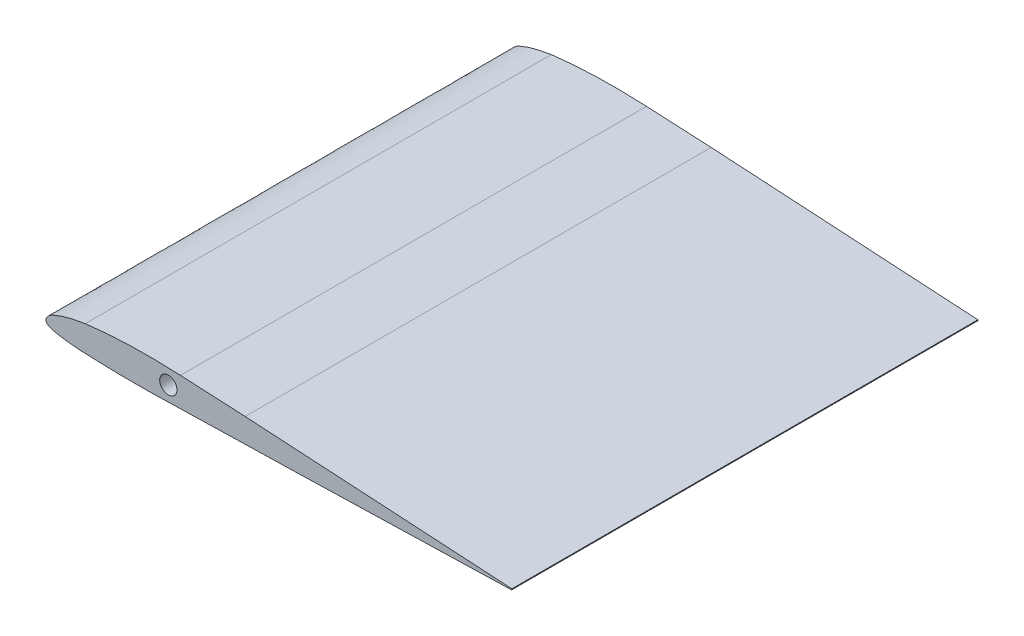
ISO-10303-21;
HEADER;
FILE_DESCRIPTION(('STEP AP214'),'2;1');
FILE_NAME('part.step','',(''),(''),'','','');
FILE_SCHEMA(('AUTOMOTIVE_DESIGN { 1 0 10303 214 1 1 1 1 }'));
ENDSEC;
DATA;
#1=APPLICATION_CONTEXT('core data for automotive mechanical design processes');
#2=APPLICATION_PROTOCOL_DEFINITION('international standard','automotive_design',2000,#1);
#3=PRODUCT_CONTEXT('',#1,'mechanical');
#4=PRODUCT('Part','Part','',(#3));
#5=PRODUCT_RELATED_PRODUCT_CATEGORY('part','',(#4));
#6=PRODUCT_DEFINITION_FORMATION('','',#4);
#7=PRODUCT_DEFINITION_CONTEXT('part definition',#1,'design');
#8=PRODUCT_DEFINITION('design','',#6,#7);
#9=PRODUCT_DEFINITION_SHAPE('','',#8);
#10=(LENGTH_UNIT() NAMED_UNIT(*) SI_UNIT(.MILLI.,.METRE.));
#11=(NAMED_UNIT(*) PLANE_ANGLE_UNIT() SI_UNIT($,.RADIAN.));
#12=(NAMED_UNIT(*) SI_UNIT($,.STERADIAN.) SOLID_ANGLE_UNIT());
#13=UNCERTAINTY_MEASURE_WITH_UNIT(LENGTH_MEASURE(1.E-05),#10,'distance_accuracy_value','');
#14=(GEOMETRIC_REPRESENTATION_CONTEXT(3) GLOBAL_UNCERTAINTY_ASSIGNED_CONTEXT((#13)) GLOBAL_UNIT_ASSIGNED_CONTEXT((#10,
#11,#12)) REPRESENTATION_CONTEXT('',''));
#15=CARTESIAN_POINT('',(0.,0.,0.));
#16=DIRECTION('',(0.,0.,1.));
#17=DIRECTION('',(1.,0.,0.));
#18=AXIS2_PLACEMENT_3D('',#15,#16,#17);
#19=CARTESIAN_POINT('',(202.827832333047,8.99151171703338,203.2));
#20=DIRECTION('',(0.,0.,-1.));
#21=DIRECTION('',(-1.,0.,0.));
#22=AXIS2_PLACEMENT_3D('',#19,#20,#21);
#23=CYLINDRICAL_SURFACE('',#22,0.372086183591873);
#24=CARTESIAN_POINT('',(202.827832333047,8.99151171703338,0.));
#25=DIRECTION('',(0.,0.,1.));
#26=DIRECTION('',(-1.,0.,0.));
#27=AXIS2_PLACEMENT_3D('',#24,#25,#26);
#28=CIRCLE('',#27,0.372086183591873);
#29=CARTESIAN_POINT('',(202.994130811724,8.65865597649471,0.));
#30=VERTEX_POINT('',#29);
#31=CARTESIAN_POINT('',(203.160688073585,9.15781019571088,0.));
#32=VERTEX_POINT('',#31);
#33=EDGE_CURVE('E127',#30,#32,#28,.T.);
#34=ORIENTED_EDGE('',*,*,#33,.T.);
#35=DIRECTION('',(0.,0.,-1.));
#36=VECTOR('',#35,1.);
#37=CARTESIAN_POINT('',(203.160688073585,9.15781019571088,203.2));
#38=LINE('',#37,#36);
#39=CARTESIAN_POINT('',(203.160688073585,9.15781019571088,203.2));
#40=VERTEX_POINT('',#39);
#41=EDGE_CURVE('E11',#40,#32,#38,.T.);
#42=ORIENTED_EDGE('',*,*,#41,.F.);
#43=CARTESIAN_POINT('',(202.827832333047,8.99151171703338,203.2));
#44=DIRECTION('',(0.,0.,1.));
#45=DIRECTION('',(-1.,0.,0.));
#46=AXIS2_PLACEMENT_3D('',#43,#44,#45);
#47=CIRCLE('',#46,0.372086183591873);
#48=CARTESIAN_POINT('',(202.994130811724,8.65865597649471,203.2));
#49=VERTEX_POINT('',#48);
#50=EDGE_CURVE('E150',#49,#40,#47,.T.);
#51=ORIENTED_EDGE('',*,*,#50,.F.);
#52=DIRECTION('',(0.,0.,-1.));
#53=VECTOR('',#52,1.);
#54=CARTESIAN_POINT('',(202.994130811724,8.65865597649471,203.2));
#55=LINE('',#54,#53);
#56=EDGE_CURVE('E120',#49,#30,#55,.T.);
#57=ORIENTED_EDGE('',*,*,#56,.T.);
#58=EDGE_LOOP('',(#34,#42,#51,#57));
#59=FACE_BOUND('',#58,.T.);
#60=ADVANCED_FACE('F34',(#59),#23,.T.);
#61=CARTESIAN_POINT('',(86.8464684635656,16.0766133823899,203.2));
#62=DIRECTION('',(-0.0593787685571856,-0.998235524234953,0.));
#63=DIRECTION('',(0.998235524234953,-0.0593787685571856,0.));
#64=AXIS2_PLACEMENT_3D('',#61,#62,#63);
#65=PLANE('',#64);
#66=DIRECTION('',(-0.998235524234953,0.0593787685571856,0.));
#67=VECTOR('',#66,1.);
#68=CARTESIAN_POINT('',(86.8464684635656,16.0766133823899,0.));
#69=LINE('',#68,#67);
#70=CARTESIAN_POINT('',(86.8464684635656,16.0766133823899,0.));
#71=VERTEX_POINT('',#70);
#72=EDGE_CURVE('E130',#32,#71,#69,.T.);
#73=ORIENTED_EDGE('',*,*,#72,.T.);
#74=DIRECTION('',(0.,0.,-1.));
#75=VECTOR('',#74,1.);
#76=CARTESIAN_POINT('',(86.8464684635656,16.0766133823899,203.2));
#77=LINE('',#76,#75);
#78=CARTESIAN_POINT('',(86.8464684635656,16.0766133823899,203.2));
#79=VERTEX_POINT('',#78);
#80=EDGE_CURVE('E42',#79,#71,#77,.T.);
#81=ORIENTED_EDGE('',*,*,#80,.F.);
#82=DIRECTION('',(-0.998235524234953,0.0593787685571858,0.));
#83=VECTOR('',#82,1.);
#84=CARTESIAN_POINT('',(160.978559463566,11.6669603823899,203.2));
#85=LINE('',#84,#83);
#86=EDGE_CURVE('E90',#40,#79,#85,.T.);
#87=ORIENTED_EDGE('',*,*,#86,.F.);
#88=ORIENTED_EDGE('',*,*,#41,.T.);
#89=EDGE_LOOP('',(#73,#81,#87,#88));
#90=FACE_BOUND('',#89,.T.);
#91=ADVANCED_FACE('F183',(#90),#65,.F.);
#92=CARTESIAN_POINT('',(58.6413294635656,17.4910303823899,203.2));
#93=DIRECTION('',(-0.0500845565723408,-0.998744981060206,0.));
#94=DIRECTION('',(0.998744981060206,-0.0500845565723408,0.));
#95=AXIS2_PLACEMENT_3D('',#92,#93,#94);
#96=PLANE('',#95);
#97=DIRECTION('',(-0.998744981060206,0.0500845565723408,0.));
#98=VECTOR('',#97,1.);
#99=CARTESIAN_POINT('',(58.6413294635656,17.4910303823899,0.));
#100=LINE('',#99,#98);
#101=CARTESIAN_POINT('',(58.6413294635656,17.4910303823899,0.));
#102=VERTEX_POINT('',#101);
#103=EDGE_CURVE('E133',#71,#102,#100,.T.);
#104=ORIENTED_EDGE('',*,*,#103,.T.);
#105=DIRECTION('',(0.,0.,-1.));
#106=VECTOR('',#105,1.);
#107=CARTESIAN_POINT('',(58.6413294635656,17.4910303823899,203.2));
#108=LINE('',#107,#106);
#109=CARTESIAN_POINT('',(58.6413294635656,17.4910303823899,203.2));
#110=VERTEX_POINT('',#109);
#111=EDGE_CURVE('E154',#110,#102,#108,.T.);
#112=ORIENTED_EDGE('',*,*,#111,.F.);
#113=DIRECTION('',(-0.998744981060206,0.0500845565723408,0.));
#114=VECTOR('',#113,1.);
#115=CARTESIAN_POINT('',(58.6413294635656,17.4910303823899,203.2));
#116=LINE('',#115,#114);
#117=EDGE_CURVE('E162',#79,#110,#116,.T.);
#118=ORIENTED_EDGE('',*,*,#117,.F.);
#119=ORIENTED_EDGE('',*,*,#80,.T.);
#120=EDGE_LOOP('',(#104,#112,#118,#119));
#121=FACE_BOUND('',#120,.T.);
#122=ADVANCED_FACE('F160',(#121),#96,.F.);
#123=CARTESIAN_POINT('',(58.6413294635656,17.4910303823899,203.2));
#124=CARTESIAN_POINT('',(42.670326444902,18.2919361384881,203.2));
#125=CARTESIAN_POINT('',(28.8324992549502,17.7256532786536,203.2));
#126=CARTESIAN_POINT('',(17.1496206863918,16.2749573556541,203.2));
#127=B_SPLINE_CURVE_WITH_KNOTS('',3,(#123,#124,#125,#126),.UNSPECIFIED.,.F.,.F.,(4,4),(0.,1.),.UNSPECIFIED.);
#128=DIRECTION('',(0.,0.,-1.));
#129=VECTOR('',#128,1.);
#130=SURFACE_OF_LINEAR_EXTRUSION('',#127,#129);
#131=CARTESIAN_POINT('',(58.6413294635656,17.4910303823899,0.));
#132=CARTESIAN_POINT('',(42.670326444902,18.2919361384881,0.));
#133=CARTESIAN_POINT('',(28.8324992549502,17.7256532786536,0.));
#134=CARTESIAN_POINT('',(17.1496206863918,16.2749573556541,0.));
#135=B_SPLINE_CURVE_WITH_KNOTS('',3,(#131,#132,#133,#134),.UNSPECIFIED.,.F.,.F.,(4,4),(0.,1.),.UNSPECIFIED.);
#136=CARTESIAN_POINT('',(17.1496206863918,16.2749573556541,0.));
#137=VERTEX_POINT('',#136);
#138=EDGE_CURVE('E135',#102,#137,#135,.T.);
#139=ORIENTED_EDGE('',*,*,#138,.T.);
#140=DIRECTION('',(0.,0.,-1.));
#141=VECTOR('',#140,1.);
#142=CARTESIAN_POINT('',(17.1496206863918,16.2749573556541,203.2));
#143=LINE('',#142,#141);
#144=CARTESIAN_POINT('',(17.1496206863918,16.2749573556541,203.2));
#145=VERTEX_POINT('',#144);
#146=EDGE_CURVE('E115',#145,#137,#143,.T.);
#147=ORIENTED_EDGE('',*,*,#146,.F.);
#148=EDGE_CURVE('E106',#110,#145,#127,.T.);
#149=ORIENTED_EDGE('',*,*,#148,.F.);
#150=ORIENTED_EDGE('',*,*,#111,.T.);
#151=EDGE_LOOP('',(#139,#147,#149,#150));
#152=FACE_BOUND('',#151,.T.);
#153=ADVANCED_FACE('F168',(#152),#130,.F.);
#154=CARTESIAN_POINT('',(17.1496206863918,16.2749573556541,203.2));
#155=CARTESIAN_POINT('',(14.6911508328745,15.883501489424,203.2));
#156=CARTESIAN_POINT('',(12.2625608927409,15.4044355735924,203.2));
#157=CARTESIAN_POINT('',(9.89088170654877,14.8216411169971,203.2));
#158=CARTESIAN_POINT('',(8.28184819256666,14.4262521377944,203.2));
#159=CARTESIAN_POINT('',(6.70259585301024,13.905021951852,203.2));
#160=CARTESIAN_POINT('',(5.15249830421664,13.3197708235176,203.2));
#161=CARTESIAN_POINT('',(3.24063855874871,12.5979336242246,203.2));
#162=CARTESIAN_POINT('',(-0.0833486666741677,11.3694216875817,203.2));
#163=CARTESIAN_POINT('',(0.00159699170179222,8.74063360073293,203.2));
#164=CARTESIAN_POINT('',(0.0923191376371333,5.93308226723629,203.2));
#165=CARTESIAN_POINT('',(13.7572349452704,5.24004469158371,203.2));
#166=CARTESIAN_POINT('',(14.3084754246685,5.18006153730816,203.2));
#167=CARTESIAN_POINT('',(14.3700936260126,5.1733565615026,203.2));
#168=CARTESIAN_POINT('',(14.4129477542588,5.09959535693695,203.2));
#169=CARTESIAN_POINT('',(14.4748786555438,5.09708081851643,203.2));
#170=CARTESIAN_POINT('',(18.4101963856463,4.93729777929063,203.2));
#171=CARTESIAN_POINT('',(22.3483586461358,4.85362360668824,203.2));
#172=CARTESIAN_POINT('',(26.2836763762383,4.69384056746245,203.2));
#173=CARTESIAN_POINT('',(32.5986850781795,4.43743654818464,203.2));
#174=CARTESIAN_POINT('',(38.9235723916568,4.56892126835046,203.2));
#175=CARTESIAN_POINT('',(45.2437485262861,4.54767146935359,203.2));
#176=B_SPLINE_CURVE_WITH_KNOTS('',3,(#154,#155,#156,#157,#158,#159,#160,#161,#162,#163,#164,
#165,#166,#167,#168,#169,#170,#171,#172,#173,#174,#175),.UNSPECIFIED.,.F.,.F.,(4,3,3,3,3,3,3,4),
(0.,0.272168289194926,1.27216828919493,2.27216828919493,3.27216828919493,4.27216828919493,
5.27216828919493,6.27216828919493),.UNSPECIFIED.);
#177=DIRECTION('',(0.,0.,-1.));
#178=VECTOR('',#177,1.);
#179=SURFACE_OF_LINEAR_EXTRUSION('',#176,#178);
#180=CARTESIAN_POINT('',(17.1496206863918,16.2749573556541,0.));
#181=CARTESIAN_POINT('',(14.6911508328745,15.883501489424,0.));
#182=CARTESIAN_POINT('',(12.2625608927409,15.4044355735924,0.));
#183=CARTESIAN_POINT('',(9.89088170654877,14.8216411169971,0.));
#184=CARTESIAN_POINT('',(8.28184819256666,14.4262521377944,0.));
#185=CARTESIAN_POINT('',(6.70259585301024,13.905021951852,0.));
#186=CARTESIAN_POINT('',(5.15249830421664,13.3197708235176,0.));
#187=CARTESIAN_POINT('',(3.24063855874871,12.5979336242246,0.));
#188=CARTESIAN_POINT('',(-0.0833486666741677,11.3694216875817,0.));
#189=CARTESIAN_POINT('',(0.00159699170179222,8.74063360073293,0.));
#190=CARTESIAN_POINT('',(0.0923191376371333,5.93308226723629,0.));
#191=CARTESIAN_POINT('',(13.7572349452704,5.24004469158371,0.));
#192=CARTESIAN_POINT('',(14.3084754246685,5.18006153730816,0.));
#193=CARTESIAN_POINT('',(14.3700936260126,5.1733565615026,0.));
#194=CARTESIAN_POINT('',(14.4129477542588,5.09959535693695,0.));
#195=CARTESIAN_POINT('',(14.4748786555438,5.09708081851643,0.));
#196=CARTESIAN_POINT('',(18.4101963856463,4.93729777929063,0.));
#197=CARTESIAN_POINT('',(22.3483586461358,4.85362360668824,0.));
#198=CARTESIAN_POINT('',(26.2836763762383,4.69384056746245,0.));
#199=CARTESIAN_POINT('',(32.5986850781795,4.43743654818464,0.));
#200=CARTESIAN_POINT('',(38.9235723916568,4.56892126835046,0.));
#201=CARTESIAN_POINT('',(45.2437485262861,4.54767146935359,0.));
#202=B_SPLINE_CURVE_WITH_KNOTS('',3,(#180,#181,#182,#183,#184,#185,#186,#187,#188,#189,#190,
#191,#192,#193,#194,#195,#196,#197,#198,#199,#200,#201),.UNSPECIFIED.,.F.,.F.,(4,3,3,3,3,3,3,4),
(0.,0.272168289194926,1.27216828919493,2.27216828919493,3.27216828919493,4.27216828919493,
5.27216828919493,6.27216828919493),.UNSPECIFIED.);
#203=CARTESIAN_POINT('',(45.2437485262863,4.54767146935345,0.));
#204=VERTEX_POINT('',#203);
#205=EDGE_CURVE('E114',#137,#204,#202,.T.);
#206=ORIENTED_EDGE('',*,*,#205,.T.);
#207=DIRECTION('',(0.,0.,-1.));
#208=VECTOR('',#207,1.);
#209=CARTESIAN_POINT('',(45.2437485262863,4.54767146935345,203.2));
#210=LINE('',#209,#208);
#211=CARTESIAN_POINT('',(45.2437485262863,4.54767146935345,203.2));
#212=VERTEX_POINT('',#211);
#213=EDGE_CURVE('E111',#212,#204,#210,.T.);
#214=ORIENTED_EDGE('',*,*,#213,.F.);
#215=EDGE_CURVE('E100',#145,#212,#176,.T.);
#216=ORIENTED_EDGE('',*,*,#215,.F.);
#217=ORIENTED_EDGE('',*,*,#146,.T.);
#218=EDGE_LOOP('',(#206,#214,#216,#217));
#219=FACE_BOUND('',#218,.T.);
#220=ADVANCED_FACE('F112',(#219),#179,.F.);
#221=CARTESIAN_POINT('',(110.583708872767,6.15529417369737,203.2));
#222=DIRECTION('',(-0.0245965305911917,0.999697459576084,0.));
#223=DIRECTION('',(-0.999697459576084,-0.0245965305911917,0.));
#224=AXIS2_PLACEMENT_3D('',#221,#222,#223);
#225=PLANE('',#224);
#226=DIRECTION('',(0.999697459576084,0.0245965305911917,0.));
#227=VECTOR('',#226,1.);
#228=CARTESIAN_POINT('',(110.583708872767,6.15529417369737,0.));
#229=LINE('',#228,#227);
#230=CARTESIAN_POINT('',(110.583708872767,6.15529417369737,0.));
#231=VERTEX_POINT('',#230);
#232=EDGE_CURVE('E76',#204,#231,#229,.T.);
#233=ORIENTED_EDGE('',*,*,#232,.T.);
#234=DIRECTION('',(0.,0.,-1.));
#235=VECTOR('',#234,1.);
#236=CARTESIAN_POINT('',(110.583708872767,6.15529417369737,203.2));
#237=LINE('',#236,#235);
#238=CARTESIAN_POINT('',(110.583708872767,6.15529417369737,203.2));
#239=VERTEX_POINT('',#238);
#240=EDGE_CURVE('E116',#239,#231,#237,.T.);
#241=ORIENTED_EDGE('',*,*,#240,.F.);
#242=DIRECTION('',(0.999697459576084,0.0245965305911917,0.));
#243=VECTOR('',#242,1.);
#244=CARTESIAN_POINT('',(110.583708872767,6.15529417369737,203.2));
#245=LINE('',#244,#243);
#246=EDGE_CURVE('E104',#212,#239,#245,.T.);
#247=ORIENTED_EDGE('',*,*,#246,.F.);
#248=ORIENTED_EDGE('',*,*,#213,.T.);
#249=EDGE_LOOP('',(#233,#241,#247,#248));
#250=FACE_BOUND('',#249,.T.);
#251=ADVANCED_FACE('F118',(#250),#225,.F.);
#252=CARTESIAN_POINT('',(202.994130811724,8.65865597649471,203.2));
#253=DIRECTION('',(-0.0270796703840823,0.999633278483609,0.));
#254=DIRECTION('',(-0.99963327848361,-0.0270796703840823,0.));
#255=AXIS2_PLACEMENT_3D('',#252,#253,#254);
#256=PLANE('',#255);
#257=DIRECTION('',(0.99963327848361,0.0270796703840823,0.));
#258=VECTOR('',#257,1.);
#259=CARTESIAN_POINT('',(202.994130811724,8.65865597649471,0.));
#260=LINE('',#259,#258);
#261=EDGE_CURVE('E82',#231,#30,#260,.T.);
#262=ORIENTED_EDGE('',*,*,#261,.T.);
#263=ORIENTED_EDGE('',*,*,#56,.F.);
#264=DIRECTION('',(0.99963327848361,0.0270796703840823,0.));
#265=VECTOR('',#264,1.);
#266=CARTESIAN_POINT('',(202.994130811724,8.65865597649471,203.2));
#267=LINE('',#266,#265);
#268=EDGE_CURVE('E50',#239,#49,#267,.T.);
#269=ORIENTED_EDGE('',*,*,#268,.F.);
#270=ORIENTED_EDGE('',*,*,#240,.T.);
#271=EDGE_LOOP('',(#262,#263,#269,#270));
#272=FACE_BOUND('',#271,.T.);
#273=ADVANCED_FACE('F191',(#272),#256,.F.);
#274=CARTESIAN_POINT('',(202.827832333047,8.99151171703338,203.2));
#275=DIRECTION('',(0.,0.,-1.));
#276=DIRECTION('',(-1.,0.,0.));
#277=AXIS2_PLACEMENT_3D('',#274,#275,#276);
#278=PLANE('',#277);
#279=CARTESIAN_POINT('',(53.3400000000001,11.2283654921006,203.2));
#280=DIRECTION('',(0.,0.,-1.));
#281=DIRECTION('',(-1.,0.,0.));
#282=AXIS2_PLACEMENT_3D('',#279,#280,#281);
#283=CIRCLE('',#282,3.75919999999999);
#284=CARTESIAN_POINT('',(49.5808000000001,11.2283654921006,203.2));
#285=VERTEX_POINT('',#284);
#286=EDGE_CURVE('E131',#285,#285,#283,.F.);
#287=ORIENTED_EDGE('',*,*,#286,.F.);
#288=EDGE_LOOP('',(#287));
#289=FACE_BOUND('',#288,.T.);
#290=ORIENTED_EDGE('',*,*,#50,.T.);
#291=ORIENTED_EDGE('',*,*,#86,.T.);
#292=ORIENTED_EDGE('',*,*,#117,.T.);
#293=ORIENTED_EDGE('',*,*,#148,.T.);
#294=ORIENTED_EDGE('',*,*,#215,.T.);
#295=ORIENTED_EDGE('',*,*,#246,.T.);
#296=ORIENTED_EDGE('',*,*,#268,.T.);
#297=EDGE_LOOP('',(#290,#291,#292,#293,#294,#295,#296));
#298=FACE_BOUND('',#297,.T.);
#299=ADVANCED_FACE('F102',(#289,#298),#278,.F.);
#300=CARTESIAN_POINT('',(202.827832333047,8.99151171703338,0.));
#301=DIRECTION('',(0.,0.,-1.));
#302=DIRECTION('',(-1.,0.,0.));
#303=AXIS2_PLACEMENT_3D('',#300,#301,#302);
#304=PLANE('',#303);
#305=CARTESIAN_POINT('',(53.3400000000001,11.2283654921006,0.));
#306=DIRECTION('',(0.,0.,-1.));
#307=DIRECTION('',(-1.,0.,0.));
#308=AXIS2_PLACEMENT_3D('',#305,#306,#307);
#309=CIRCLE('',#308,3.75919999999999);
#310=CARTESIAN_POINT('',(49.5808000000001,11.2283654921006,0.));
#311=VERTEX_POINT('',#310);
#312=EDGE_CURVE('E212',#311,#311,#309,.T.);
#313=ORIENTED_EDGE('',*,*,#312,.F.);
#314=EDGE_LOOP('',(#313));
#315=FACE_BOUND('',#314,.T.);
#316=ORIENTED_EDGE('',*,*,#33,.F.);
#317=ORIENTED_EDGE('',*,*,#261,.F.);
#318=ORIENTED_EDGE('',*,*,#232,.F.);
#319=ORIENTED_EDGE('',*,*,#205,.F.);
#320=ORIENTED_EDGE('',*,*,#138,.F.);
#321=ORIENTED_EDGE('',*,*,#103,.F.);
#322=ORIENTED_EDGE('',*,*,#72,.F.);
#323=EDGE_LOOP('',(#316,#317,#318,#319,#320,#321,#322));
#324=FACE_BOUND('',#323,.T.);
#325=ADVANCED_FACE('F166',(#315,#324),#304,.T.);
#326=CARTESIAN_POINT('',(53.3400000000001,11.2283654921006,203.201));
#327=DIRECTION('',(0.,0.,-1.));
#328=DIRECTION('',(-1.,0.,0.));
#329=AXIS2_PLACEMENT_3D('',#326,#327,#328);
#330=CYLINDRICAL_SURFACE('',#329,3.75919999999999);
#331=ORIENTED_EDGE('',*,*,#312,.T.);
#332=EDGE_LOOP('',(#331));
#333=FACE_BOUND('',#332,.T.);
#334=ORIENTED_EDGE('',*,*,#286,.T.);
#335=EDGE_LOOP('',(#334));
#336=FACE_BOUND('',#335,.T.);
#337=ADVANCED_FACE('F202',(#333,#336),#330,.F.);
#338=CLOSED_SHELL('',(#60,#91,#122,#153,#220,#251,#273,#299,#325,#337));
#339=MANIFOLD_SOLID_BREP('B2',#338);
#340=ADVANCED_BREP_SHAPE_REPRESENTATION('',(#18,#339),#14);
#341=SHAPE_DEFINITION_REPRESENTATION(#9,#340);
ENDSEC;
END-ISO-10303-21;
